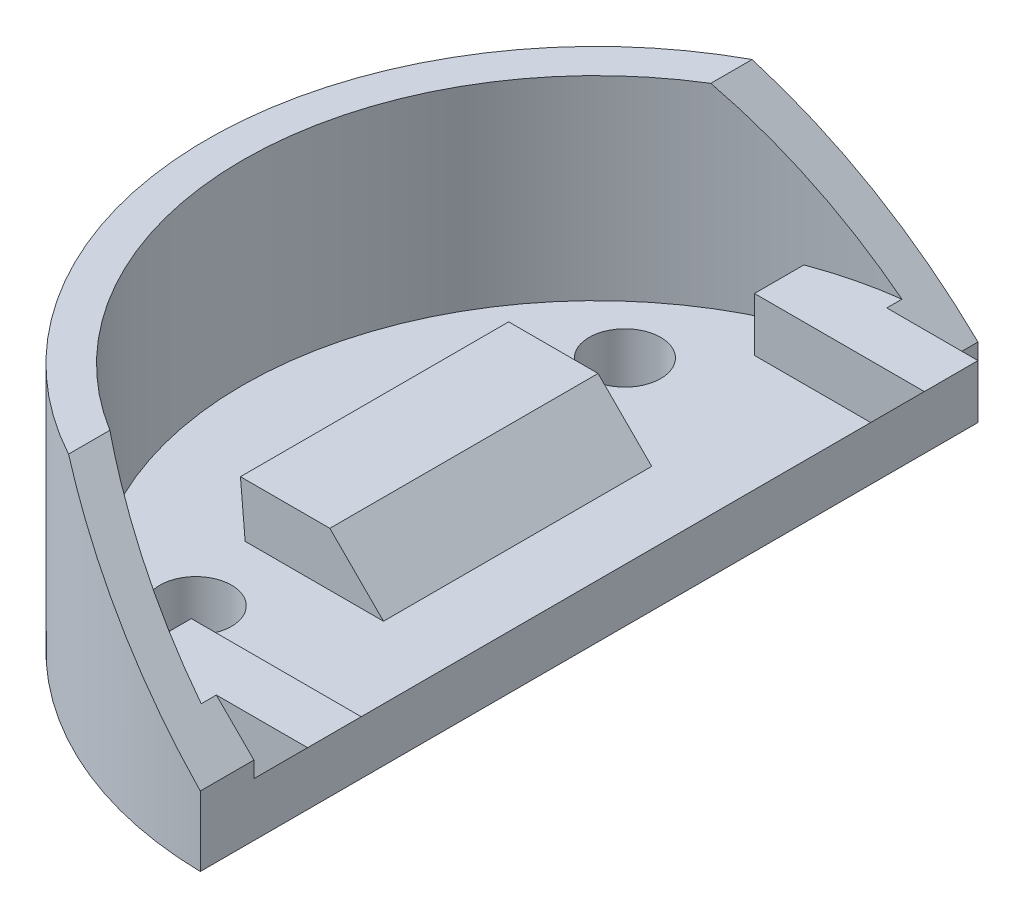
ISO-10303-21;
HEADER;
FILE_DESCRIPTION(('STEP AP214'),'2;1');
FILE_NAME('part.step','',(''),(''),'','','');
FILE_SCHEMA(('AUTOMOTIVE_DESIGN { 1 0 10303 214 1 1 1 1 }'));
ENDSEC;
DATA;
#1=APPLICATION_CONTEXT('core data for automotive mechanical design processes');
#2=APPLICATION_PROTOCOL_DEFINITION('international standard','automotive_design',2000,#1);
#3=PRODUCT_CONTEXT('',#1,'mechanical');
#4=PRODUCT('Part','Part','',(#3));
#5=PRODUCT_RELATED_PRODUCT_CATEGORY('part','',(#4));
#6=PRODUCT_DEFINITION_FORMATION('','',#4);
#7=PRODUCT_DEFINITION_CONTEXT('part definition',#1,'design');
#8=PRODUCT_DEFINITION('design','',#6,#7);
#9=PRODUCT_DEFINITION_SHAPE('','',#8);
#10=(LENGTH_UNIT() NAMED_UNIT(*) SI_UNIT(.MILLI.,.METRE.));
#11=(NAMED_UNIT(*) PLANE_ANGLE_UNIT() SI_UNIT($,.RADIAN.));
#12=(NAMED_UNIT(*) SI_UNIT($,.STERADIAN.) SOLID_ANGLE_UNIT());
#13=UNCERTAINTY_MEASURE_WITH_UNIT(LENGTH_MEASURE(1.E-05),#10,'distance_accuracy_value','');
#14=(GEOMETRIC_REPRESENTATION_CONTEXT(3) GLOBAL_UNCERTAINTY_ASSIGNED_CONTEXT((#13)) GLOBAL_UNIT_ASSIGNED_CONTEXT((#10,
#11,#12)) REPRESENTATION_CONTEXT('',''));
#15=CARTESIAN_POINT('',(0.,0.,0.));
#16=DIRECTION('',(0.,0.,1.));
#17=DIRECTION('',(1.,0.,0.));
#18=AXIS2_PLACEMENT_3D('',#15,#16,#17);
#19=CARTESIAN_POINT('',(0.,3.81,0.));
#20=DIRECTION('',(0.,1.,0.));
#21=DIRECTION('',(0.,0.,1.));
#22=AXIS2_PLACEMENT_3D('',#19,#20,#21);
#23=PLANE('',#22);
#24=CARTESIAN_POINT('',(-13.1820790968143,3.81,15.2400000000031));
#25=DIRECTION('',(0.,1.,0.));
#26=DIRECTION('',(0.,0.,1.));
#27=AXIS2_PLACEMENT_3D('',#24,#25,#26);
#28=CIRCLE('',#27,2.54000000000118);
#29=CARTESIAN_POINT('',(-13.1820790968143,3.81,12.700000000002));
#30=VERTEX_POINT('',#29);
#31=EDGE_CURVE('E223',#30,#30,#28,.T.);
#32=ORIENTED_EDGE('',*,*,#31,.F.);
#33=EDGE_LOOP('',(#32));
#34=FACE_BOUND('',#33,.T.);
#35=CARTESIAN_POINT('',(-13.1820790968145,3.81,-15.2399999999969));
#36=DIRECTION('',(0.,1.,0.));
#37=DIRECTION('',(0.,0.,1.));
#38=AXIS2_PLACEMENT_3D('',#35,#36,#37);
#39=CIRCLE('',#38,2.54000000000163);
#40=CARTESIAN_POINT('',(-13.1820790968145,3.81,-17.7799999999985));
#41=VERTEX_POINT('',#40);
#42=EDGE_CURVE('E226',#41,#41,#39,.T.);
#43=ORIENTED_EDGE('',*,*,#42,.F.);
#44=EDGE_LOOP('',(#43));
#45=FACE_BOUND('',#44,.T.);
#46=DIRECTION('',(0.,0.,1.));
#47=VECTOR('',#46,1.);
#48=CARTESIAN_POINT('',(-5.5620790968136,3.81,-9.525));
#49=LINE('',#48,#47);
#50=CARTESIAN_POINT('',(-5.5620790968136,3.81,-9.525));
#51=VERTEX_POINT('',#50);
#52=CARTESIAN_POINT('',(-5.56207909681359,3.81,9.525));
#53=VERTEX_POINT('',#52);
#54=EDGE_CURVE('E202',#51,#53,#49,.T.);
#55=ORIENTED_EDGE('',*,*,#54,.T.);
#56=DIRECTION('',(-1.,0.,0.));
#57=VECTOR('',#56,1.);
#58=CARTESIAN_POINT('',(-5.56207909681359,3.81,9.525));
#59=LINE('',#58,#57);
#60=CARTESIAN_POINT('',(-15.3887472887798,3.81,9.52500000000001));
#61=VERTEX_POINT('',#60);
#62=EDGE_CURVE('E197',#53,#61,#59,.T.);
#63=ORIENTED_EDGE('',*,*,#62,.T.);
#64=DIRECTION('',(0.,0.,-1.));
#65=VECTOR('',#64,1.);
#66=CARTESIAN_POINT('',(-15.3887472887798,3.81,14.9131536726415));
#67=LINE('',#66,#65);
#68=CARTESIAN_POINT('',(-15.3887472887798,3.81,-9.525));
#69=VERTEX_POINT('',#68);
#70=EDGE_CURVE('E391',#61,#69,#67,.T.);
#71=ORIENTED_EDGE('',*,*,#70,.T.);
#72=DIRECTION('',(-1.,0.,0.));
#73=VECTOR('',#72,1.);
#74=CARTESIAN_POINT('',(-5.5620790968136,3.81,-9.525));
#75=LINE('',#74,#73);
#76=EDGE_CURVE('E206',#51,#69,#75,.T.);
#77=ORIENTED_EDGE('',*,*,#76,.F.);
#78=EDGE_LOOP('',(#55,#63,#71,#77));
#79=FACE_BOUND('',#78,.T.);
#80=DIRECTION('',(0.,0.,1.));
#81=VECTOR('',#80,1.);
#82=CARTESIAN_POINT('',(-8.7370790968136,3.81,-23.8082929594574));
#83=LINE('',#82,#81);
#84=CARTESIAN_POINT('',(-8.7370790968136,3.81,-23.5120528000423));
#85=VERTEX_POINT('',#84);
#86=CARTESIAN_POINT('',(-8.7370790968136,3.81,-19.9982929594574));
#87=VERTEX_POINT('',#86);
#88=EDGE_CURVE('E215',#85,#87,#83,.T.);
#89=ORIENTED_EDGE('',*,*,#88,.F.);
#90=CARTESIAN_POINT('',(0.,3.81,0.));
#91=DIRECTION('',(0.,-1.,0.));
#92=DIRECTION('',(0.,0.,1.));
#93=AXIS2_PLACEMENT_3D('',#90,#91,#92);
#94=CIRCLE('',#93,25.082926025804);
#95=CARTESIAN_POINT('',(-8.73707909681359,3.81,23.5120528000424));
#96=VERTEX_POINT('',#95);
#97=EDGE_CURVE('E188',#96,#85,#94,.T.);
#98=ORIENTED_EDGE('',*,*,#97,.F.);
#99=DIRECTION('',(0.,0.,-1.));
#100=VECTOR('',#99,1.);
#101=CARTESIAN_POINT('',(-8.73707909681359,3.81,23.8082929594574));
#102=LINE('',#101,#100);
#103=CARTESIAN_POINT('',(-8.73707909681359,3.81,19.9982929594574));
#104=VERTEX_POINT('',#103);
#105=EDGE_CURVE('E320',#96,#104,#102,.T.);
#106=ORIENTED_EDGE('',*,*,#105,.T.);
#107=DIRECTION('',(-1.,0.,0.));
#108=VECTOR('',#107,1.);
#109=CARTESIAN_POINT('',(4.59792090318641,3.81,19.9982929594574));
#110=LINE('',#109,#108);
#111=CARTESIAN_POINT('',(-0.482079096814084,3.81,19.9982929594574));
#112=VERTEX_POINT('',#111);
#113=EDGE_CURVE('E317',#112,#104,#110,.T.);
#114=ORIENTED_EDGE('',*,*,#113,.F.);
#115=DIRECTION('',(0.,0.,1.));
#116=VECTOR('',#115,1.);
#117=CARTESIAN_POINT('',(-0.482079096813858,3.81,0.));
#118=LINE('',#117,#116);
#119=CARTESIAN_POINT('',(-0.482079096813633,3.81,-19.9982929594574));
#120=VERTEX_POINT('',#119);
#121=EDGE_CURVE('E218',#120,#112,#118,.T.);
#122=ORIENTED_EDGE('',*,*,#121,.F.);
#123=DIRECTION('',(-1.,0.,0.));
#124=VECTOR('',#123,1.);
#125=CARTESIAN_POINT('',(4.5979209031864,3.81,-19.9982929594574));
#126=LINE('',#125,#124);
#127=EDGE_CURVE('E333',#120,#87,#126,.T.);
#128=ORIENTED_EDGE('',*,*,#127,.T.);
#129=EDGE_LOOP('',(#89,#98,#106,#114,#122,#128));
#130=FACE_BOUND('',#129,.T.);
#131=ADVANCED_FACE('F47',(#34,#45,#79,#130),#23,.T.);
#132=CARTESIAN_POINT('',(-8.7370790968136,7.62,-23.8082929594574));
#133=DIRECTION('',(1.,0.,0.));
#134=DIRECTION('',(0.,0.,-1.));
#135=AXIS2_PLACEMENT_3D('',#132,#133,#134);
#136=PLANE('',#135);
#137=DIRECTION('',(0.,-1.,0.));
#138=VECTOR('',#137,1.);
#139=CARTESIAN_POINT('',(-8.73707909681359,17.653,-23.5120528000423));
#140=LINE('',#139,#138);
#141=CARTESIAN_POINT('',(-8.7370790968136,7.62,-23.5120528000423));
#142=VERTEX_POINT('',#141);
#143=EDGE_CURVE('E303',#85,#142,#140,.F.);
#144=ORIENTED_EDGE('',*,*,#143,.F.);
#145=ORIENTED_EDGE('',*,*,#88,.T.);
#146=DIRECTION('',(0.,-1.,0.));
#147=VECTOR('',#146,1.);
#148=CARTESIAN_POINT('',(-8.7370790968136,7.62,-19.9982929594574));
#149=LINE('',#148,#147);
#150=CARTESIAN_POINT('',(-8.7370790968136,7.62,-19.9982929594574));
#151=VERTEX_POINT('',#150);
#152=EDGE_CURVE('E329',#151,#87,#149,.T.);
#153=ORIENTED_EDGE('',*,*,#152,.F.);
#154=DIRECTION('',(0.,0.,1.));
#155=VECTOR('',#154,1.);
#156=CARTESIAN_POINT('',(-8.7370790968136,7.62,-26.2043117655477));
#157=LINE('',#156,#155);
#158=EDGE_CURVE('E337',#142,#151,#157,.T.);
#159=ORIENTED_EDGE('',*,*,#158,.F.);
#160=EDGE_LOOP('',(#144,#145,#153,#159));
#161=FACE_BOUND('',#160,.T.);
#162=ADVANCED_FACE('F342',(#161),#136,.F.);
#163=CARTESIAN_POINT('',(0.,7.62,0.));
#164=DIRECTION('',(0.,-1.,0.));
#165=DIRECTION('',(0.,0.,-1.));
#166=AXIS2_PLACEMENT_3D('',#163,#164,#165);
#167=PLANE('',#166);
#168=DIRECTION('',(-1.,0.,0.));
#169=VECTOR('',#168,1.);
#170=CARTESIAN_POINT('',(4.5979209031864,7.62,-23.8082929594574));
#171=LINE('',#170,#169);
#172=CARTESIAN_POINT('',(3.32792090318635,7.62,-23.8082929594574));
#173=VERTEX_POINT('',#172);
#174=CARTESIAN_POINT('',(-3.14907909681375,7.62,-23.8082929594574));
#175=VERTEX_POINT('',#174);
#176=EDGE_CURVE('E209',#173,#175,#171,.T.);
#177=ORIENTED_EDGE('',*,*,#176,.T.);
#178=DIRECTION('',(0.,0.,1.));
#179=VECTOR('',#178,1.);
#180=CARTESIAN_POINT('',(-3.14907909681397,7.62,0.));
#181=LINE('',#180,#179);
#182=CARTESIAN_POINT('',(-3.14907909681374,7.62,-24.8844625993403));
#183=VERTEX_POINT('',#182);
#184=EDGE_CURVE('E273',#175,#183,#181,.F.);
#185=ORIENTED_EDGE('',*,*,#184,.T.);
#186=CARTESIAN_POINT('',(0.,7.62,0.));
#187=DIRECTION('',(0.,-1.,0.));
#188=DIRECTION('',(0.,0.,-1.));
#189=AXIS2_PLACEMENT_3D('',#186,#187,#188);
#190=CIRCLE('',#189,25.082926025804);
#191=EDGE_CURVE('E297',#142,#183,#190,.T.);
#192=ORIENTED_EDGE('',*,*,#191,.F.);
#193=ORIENTED_EDGE('',*,*,#158,.T.);
#194=DIRECTION('',(-1.,0.,0.));
#195=VECTOR('',#194,1.);
#196=CARTESIAN_POINT('',(4.5979209031864,7.62,-19.9982929594574));
#197=LINE('',#196,#195);
#198=CARTESIAN_POINT('',(3.32792090318635,7.62,-19.9982929594574));
#199=VERTEX_POINT('',#198);
#200=EDGE_CURVE('E332',#199,#151,#197,.T.);
#201=ORIENTED_EDGE('',*,*,#200,.F.);
#202=DIRECTION('',(0.,0.,1.));
#203=VECTOR('',#202,1.);
#204=CARTESIAN_POINT('',(3.32792090318635,7.62,0.));
#205=LINE('',#204,#203);
#206=EDGE_CURVE('E254',#199,#173,#205,.F.);
#207=ORIENTED_EDGE('',*,*,#206,.T.);
#208=EDGE_LOOP('',(#177,#185,#192,#193,#201,#207));
#209=FACE_BOUND('',#208,.T.);
#210=ADVANCED_FACE('F295',(#209),#167,.F.);
#211=CARTESIAN_POINT('',(-8.73707909681359,7.62,23.8082929594574));
#212=DIRECTION('',(-1.,0.,0.));
#213=DIRECTION('',(0.,0.,1.));
#214=AXIS2_PLACEMENT_3D('',#211,#212,#213);
#215=PLANE('',#214);
#216=ORIENTED_EDGE('',*,*,#105,.F.);
#217=DIRECTION('',(0.,-1.,0.));
#218=VECTOR('',#217,1.);
#219=CARTESIAN_POINT('',(-8.73707909681359,17.653,23.5120528000423));
#220=LINE('',#219,#218);
#221=CARTESIAN_POINT('',(-8.73707909681359,7.62,23.5120528000424));
#222=VERTEX_POINT('',#221);
#223=EDGE_CURVE('E304',#96,#222,#220,.F.);
#224=ORIENTED_EDGE('',*,*,#223,.T.);
#225=DIRECTION('',(0.,0.,-1.));
#226=VECTOR('',#225,1.);
#227=CARTESIAN_POINT('',(-8.73707909681359,7.62,26.2043117655477));
#228=LINE('',#227,#226);
#229=CARTESIAN_POINT('',(-8.73707909681359,7.62,19.9982929594574));
#230=VERTEX_POINT('',#229);
#231=EDGE_CURVE('E321',#222,#230,#228,.T.);
#232=ORIENTED_EDGE('',*,*,#231,.T.);
#233=DIRECTION('',(0.,-1.,0.));
#234=VECTOR('',#233,1.);
#235=CARTESIAN_POINT('',(-8.73707909681359,7.62,19.9982929594574));
#236=LINE('',#235,#234);
#237=EDGE_CURVE('E313',#230,#104,#236,.T.);
#238=ORIENTED_EDGE('',*,*,#237,.T.);
#239=EDGE_LOOP('',(#216,#224,#232,#238));
#240=FACE_BOUND('',#239,.T.);
#241=ADVANCED_FACE('F462',(#240),#215,.T.);
#242=CARTESIAN_POINT('',(0.,7.62,0.));
#243=DIRECTION('',(0.,-1.,0.));
#244=DIRECTION('',(0.,0.,-1.));
#245=AXIS2_PLACEMENT_3D('',#242,#243,#244);
#246=PLANE('',#245);
#247=DIRECTION('',(0.,0.,1.));
#248=VECTOR('',#247,1.);
#249=CARTESIAN_POINT('',(-3.14907909681397,7.62,0.));
#250=LINE('',#249,#248);
#251=CARTESIAN_POINT('',(-3.14907909681421,7.62,24.8844625993403));
#252=VERTEX_POINT('',#251);
#253=CARTESIAN_POINT('',(-3.1490790968142,7.62,23.8082929594574));
#254=VERTEX_POINT('',#253);
#255=EDGE_CURVE('E278',#252,#254,#250,.F.);
#256=ORIENTED_EDGE('',*,*,#255,.T.);
#257=DIRECTION('',(-1.,0.,0.));
#258=VECTOR('',#257,1.);
#259=CARTESIAN_POINT('',(4.59792090318641,7.62,23.8082929594574));
#260=LINE('',#259,#258);
#261=CARTESIAN_POINT('',(3.32792090318633,7.62,23.8082929594574));
#262=VERTEX_POINT('',#261);
#263=EDGE_CURVE('E62',#262,#254,#260,.T.);
#264=ORIENTED_EDGE('',*,*,#263,.F.);
#265=DIRECTION('',(0.,0.,-1.));
#266=VECTOR('',#265,1.);
#267=CARTESIAN_POINT('',(3.32792090318633,7.62,23.8082929594574));
#268=LINE('',#267,#266);
#269=CARTESIAN_POINT('',(3.32792090318633,7.62,19.9982929594574));
#270=VERTEX_POINT('',#269);
#271=EDGE_CURVE('E246',#262,#270,#268,.T.);
#272=ORIENTED_EDGE('',*,*,#271,.T.);
#273=DIRECTION('',(-1.,0.,0.));
#274=VECTOR('',#273,1.);
#275=CARTESIAN_POINT('',(4.59792090318641,7.62,19.9982929594574));
#276=LINE('',#275,#274);
#277=EDGE_CURVE('E324',#270,#230,#276,.T.);
#278=ORIENTED_EDGE('',*,*,#277,.T.);
#279=ORIENTED_EDGE('',*,*,#231,.F.);
#280=CARTESIAN_POINT('',(0.,7.62,0.));
#281=DIRECTION('',(0.,-1.,0.));
#282=DIRECTION('',(0.,0.,-1.));
#283=AXIS2_PLACEMENT_3D('',#280,#281,#282);
#284=CIRCLE('',#283,25.082926025804);
#285=EDGE_CURVE('E244',#252,#222,#284,.T.);
#286=ORIENTED_EDGE('',*,*,#285,.F.);
#287=EDGE_LOOP('',(#256,#264,#272,#278,#279,#286));
#288=FACE_BOUND('',#287,.T.);
#289=ADVANCED_FACE('F367',(#288),#246,.F.);
#290=CARTESIAN_POINT('',(0.,3.81,0.));
#291=DIRECTION('',(0.,-1.,0.));
#292=DIRECTION('',(0.,0.,-1.));
#293=AXIS2_PLACEMENT_3D('',#290,#291,#292);
#294=CYLINDRICAL_SURFACE('',#293,27.6225);
#295=CARTESIAN_POINT('',(0.,17.653,0.));
#296=DIRECTION('',(0.,1.,0.));
#297=DIRECTION('',(0.,0.,1.));
#298=AXIS2_PLACEMENT_3D('',#295,#296,#297);
#299=CIRCLE('',#298,27.6225);
#300=CARTESIAN_POINT('',(-13.1820790968138,17.653,-24.2741693356404));
#301=VERTEX_POINT('',#300);
#302=CARTESIAN_POINT('',(-13.1820790968143,17.653,24.2741693356401));
#303=VERTEX_POINT('',#302);
#304=EDGE_CURVE('E387',#301,#303,#299,.T.);
#305=ORIENTED_EDGE('',*,*,#304,.F.);
#306=CARTESIAN_POINT('',(0.,4.47092090318606,0.));
#307=DIRECTION('',(-0.707106781186544,-0.707106781186551,0.));
#308=DIRECTION('',(0.707106781186551,-0.707106781186544,0.));
#309=AXIS2_PLACEMENT_3D('',#306,#307,#308);
#310=ELLIPSE('',#309,39.0641141266506,27.6225);
#311=CARTESIAN_POINT('',(-0.482079096813597,4.95299999999991,-27.6182929594574));
#312=VERTEX_POINT('',#311);
#313=EDGE_CURVE('E267',#301,#312,#310,.T.);
#314=ORIENTED_EDGE('',*,*,#313,.T.);
#315=DIRECTION('',(0.,-1.,0.));
#316=VECTOR('',#315,1.);
#317=CARTESIAN_POINT('',(-0.482079096813597,3.81,-27.6182929594574));
#318=LINE('',#317,#316);
#319=CARTESIAN_POINT('',(-0.482079096813597,0.,-27.6182929594574));
#320=VERTEX_POINT('',#319);
#321=EDGE_CURVE('E229',#312,#320,#318,.T.);
#322=ORIENTED_EDGE('',*,*,#321,.T.);
#323=CARTESIAN_POINT('',(0.,0.,0.));
#324=DIRECTION('',(0.,1.,0.));
#325=DIRECTION('',(0.,0.,1.));
#326=AXIS2_PLACEMENT_3D('',#323,#324,#325);
#327=CIRCLE('',#326,27.6225);
#328=CARTESIAN_POINT('',(-0.48207909681412,0.,27.6182929594574));
#329=VERTEX_POINT('',#328);
#330=EDGE_CURVE('E213',#320,#329,#327,.T.);
#331=ORIENTED_EDGE('',*,*,#330,.T.);
#332=DIRECTION('',(0.,-1.,0.));
#333=VECTOR('',#332,1.);
#334=CARTESIAN_POINT('',(-0.48207909681412,3.81,27.6182929594574));
#335=LINE('',#334,#333);
#336=CARTESIAN_POINT('',(-0.48207909681412,4.95299999999991,27.6182929594574));
#337=VERTEX_POINT('',#336);
#338=EDGE_CURVE('E242',#337,#329,#335,.T.);
#339=ORIENTED_EDGE('',*,*,#338,.F.);
#340=CARTESIAN_POINT('',(0.,4.47092090318606,0.));
#341=DIRECTION('',(-0.707106781186544,-0.707106781186551,0.));
#342=DIRECTION('',(0.707106781186551,-0.707106781186544,0.));
#343=AXIS2_PLACEMENT_3D('',#340,#341,#342);
#344=ELLIPSE('',#343,39.0641141266506,27.6225);
#345=EDGE_CURVE('E265',#337,#303,#344,.T.);
#346=ORIENTED_EDGE('',*,*,#345,.T.);
#347=EDGE_LOOP('',(#305,#314,#322,#331,#339,#346));
#348=FACE_BOUND('',#347,.T.);
#349=ADVANCED_FACE('F379',(#348),#294,.T.);
#350=CARTESIAN_POINT('',(-13.1820790968143,3.81,15.2400000000031));
#351=DIRECTION('',(0.,-1.,0.));
#352=DIRECTION('',(0.,0.,-1.));
#353=AXIS2_PLACEMENT_3D('',#350,#351,#352);
#354=CYLINDRICAL_SURFACE('',#353,2.54000000000118);
#355=CARTESIAN_POINT('',(-13.1820790968143,0.,15.2400000000031));
#356=DIRECTION('',(0.,1.,0.));
#357=DIRECTION('',(0.,0.,1.));
#358=AXIS2_PLACEMENT_3D('',#355,#356,#357);
#359=CIRCLE('',#358,2.54000000000118);
#360=CARTESIAN_POINT('',(-13.1820790968143,0.,12.700000000002));
#361=VERTEX_POINT('',#360);
#362=EDGE_CURVE('E235',#361,#361,#359,.T.);
#363=CARTESIAN_POINT('',(-13.1820790968143,3.81,12.700000000002));
#364=CARTESIAN_POINT('',(-13.1820790968143,3.7703125,12.700000000002));
#365=CARTESIAN_POINT('',(-13.1820790968143,3.730625,12.700000000002));
#366=CARTESIAN_POINT('',(-13.1820790968143,3.65125,12.700000000002));
#367=CARTESIAN_POINT('',(-13.1820790968143,3.6115625,12.700000000002));
#368=CARTESIAN_POINT('',(-13.1820790968143,3.5321875,12.700000000002));
#369=CARTESIAN_POINT('',(-13.1820790968143,3.4925,12.700000000002));
#370=CARTESIAN_POINT('',(-13.1820790968143,3.413125,12.700000000002));
#371=CARTESIAN_POINT('',(-13.1820790968143,3.3734375,12.700000000002));
#372=CARTESIAN_POINT('',(-13.1820790968143,3.2940625,12.700000000002));
#373=CARTESIAN_POINT('',(-13.1820790968143,3.254375,12.700000000002));
#374=CARTESIAN_POINT('',(-13.1820790968143,3.175,12.700000000002));
#375=CARTESIAN_POINT('',(-13.1820790968143,3.1353125,12.700000000002));
#376=CARTESIAN_POINT('',(-13.1820790968143,3.0559375,12.700000000002));
#377=CARTESIAN_POINT('',(-13.1820790968143,3.01625,12.700000000002));
#378=CARTESIAN_POINT('',(-13.1820790968143,2.936875,12.700000000002));
#379=CARTESIAN_POINT('',(-13.1820790968143,2.8971875,12.700000000002));
#380=CARTESIAN_POINT('',(-13.1820790968143,2.8178125,12.700000000002));
#381=CARTESIAN_POINT('',(-13.1820790968143,2.778125,12.700000000002));
#382=CARTESIAN_POINT('',(-13.1820790968143,2.69875,12.700000000002));
#383=CARTESIAN_POINT('',(-13.1820790968143,2.6590625,12.700000000002));
#384=CARTESIAN_POINT('',(-13.1820790968143,2.5796875,12.700000000002));
#385=CARTESIAN_POINT('',(-13.1820790968143,2.54,12.700000000002));
#386=CARTESIAN_POINT('',(-13.1820790968143,2.460625,12.700000000002));
#387=CARTESIAN_POINT('',(-13.1820790968143,2.4209375,12.700000000002));
#388=CARTESIAN_POINT('',(-13.1820790968143,2.3415625,12.700000000002));
#389=CARTESIAN_POINT('',(-13.1820790968143,2.301875,12.700000000002));
#390=CARTESIAN_POINT('',(-13.1820790968143,2.2225,12.700000000002));
#391=CARTESIAN_POINT('',(-13.1820790968143,2.1828125,12.700000000002));
#392=CARTESIAN_POINT('',(-13.1820790968143,2.1034375,12.700000000002));
#393=CARTESIAN_POINT('',(-13.1820790968143,2.06375,12.700000000002));
#394=CARTESIAN_POINT('',(-13.1820790968143,1.984375,12.700000000002));
#395=CARTESIAN_POINT('',(-13.1820790968143,1.9446875,12.700000000002));
#396=CARTESIAN_POINT('',(-13.1820790968143,1.8653125,12.700000000002));
#397=CARTESIAN_POINT('',(-13.1820790968143,1.825625,12.700000000002));
#398=CARTESIAN_POINT('',(-13.1820790968143,1.74625,12.700000000002));
#399=CARTESIAN_POINT('',(-13.1820790968143,1.7065625,12.700000000002));
#400=CARTESIAN_POINT('',(-13.1820790968143,1.6271875,12.700000000002));
#401=CARTESIAN_POINT('',(-13.1820790968143,1.5875,12.700000000002));
#402=CARTESIAN_POINT('',(-13.1820790968143,1.508125,12.700000000002));
#403=CARTESIAN_POINT('',(-13.1820790968143,1.4684375,12.700000000002));
#404=CARTESIAN_POINT('',(-13.1820790968143,1.3890625,12.700000000002));
#405=CARTESIAN_POINT('',(-13.1820790968143,1.349375,12.700000000002));
#406=CARTESIAN_POINT('',(-13.1820790968143,1.27,12.700000000002));
#407=CARTESIAN_POINT('',(-13.1820790968143,1.2303125,12.700000000002));
#408=CARTESIAN_POINT('',(-13.1820790968143,1.1509375,12.700000000002));
#409=CARTESIAN_POINT('',(-13.1820790968143,1.11125,12.700000000002));
#410=CARTESIAN_POINT('',(-13.1820790968143,1.031875,12.700000000002));
#411=CARTESIAN_POINT('',(-13.1820790968143,0.9921875,12.700000000002));
#412=CARTESIAN_POINT('',(-13.1820790968143,0.9128125,12.700000000002));
#413=CARTESIAN_POINT('',(-13.1820790968143,0.873125,12.700000000002));
#414=CARTESIAN_POINT('',(-13.1820790968143,0.79375,12.700000000002));
#415=CARTESIAN_POINT('',(-13.1820790968143,0.7540625,12.700000000002));
#416=CARTESIAN_POINT('',(-13.1820790968143,0.6746875,12.700000000002));
#417=CARTESIAN_POINT('',(-13.1820790968143,0.635,12.700000000002));
#418=CARTESIAN_POINT('',(-13.1820790968143,0.555625,12.700000000002));
#419=CARTESIAN_POINT('',(-13.1820790968143,0.5159375,12.700000000002));
#420=CARTESIAN_POINT('',(-13.1820790968143,0.4365625,12.700000000002));
#421=CARTESIAN_POINT('',(-13.1820790968143,0.396875,12.700000000002));
#422=CARTESIAN_POINT('',(-13.1820790968143,0.3175,12.700000000002));
#423=CARTESIAN_POINT('',(-13.1820790968143,0.2778125,12.700000000002));
#424=CARTESIAN_POINT('',(-13.1820790968143,0.1984375,12.700000000002));
#425=CARTESIAN_POINT('',(-13.1820790968143,0.15875,12.700000000002));
#426=CARTESIAN_POINT('',(-13.1820790968143,0.0793749999999999,12.700000000002));
#427=CARTESIAN_POINT('',(-13.1820790968143,0.0396874999999999,12.700000000002));
#428=CARTESIAN_POINT('',(-13.1820790968143,0.,12.700000000002));
#429=B_SPLINE_CURVE_WITH_KNOTS('',3,(#363,#364,#365,#366,#367,#368,#369,#370,#371,#372,#373,
#374,#375,#376,#377,#378,#379,#380,#381,#382,#383,#384,#385,#386,#387,#388,#389,#390,#391,#392,
#393,#394,#395,#396,#397,#398,#399,#400,#401,#402,#403,#404,#405,#406,#407,#408,#409,#410,#411,
#412,#413,#414,#415,#416,#417,#418,#419,#420,#421,#422,#423,#424,#425,#426,#427,#428),
.UNSPECIFIED.,.F.,.F.,(4,2,2,2,2,2,2,2,2,2,2,2,2,2,2,2,2,2,2,2,2,2,2,2,2,2,2,2,2,2,2,2,4),(0.,
0.1190625,0.238125,0.3571875,0.47625,0.5953125,0.714375,0.8334375,0.9525,1.0715625,1.190625,
1.3096875,1.42875,1.5478125,1.666875,1.7859375,1.905,2.0240625,2.143125,2.2621875,2.38125,
2.5003125,2.619375,2.7384375,2.8575,2.9765625,3.095625,3.2146875,3.33375,3.4528125,3.571875,
3.6909375,3.81),.UNSPECIFIED.);
#430=EDGE_CURVE('BSEAM425',#30,#361,#429,.T.);
#431=ORIENTED_EDGE('',*,*,#31,.T.);
#432=ORIENTED_EDGE('',*,*,#362,.F.);
#433=ORIENTED_EDGE('',*,*,#430,.T.);
#434=ORIENTED_EDGE('',*,*,#430,.F.);
#435=EDGE_LOOP('',(#431,#433,#432,#434));
#436=FACE_BOUND('',#435,.T.);
#437=ADVANCED_FACE('F425',(#436),#354,.F.);
#438=CARTESIAN_POINT('',(-0.482079096813858,3.81,0.));
#439=DIRECTION('',(1.,0.,0.));
#440=DIRECTION('',(0.,0.,-1.));
#441=AXIS2_PLACEMENT_3D('',#438,#439,#440);
#442=PLANE('',#441);
#443=ORIENTED_EDGE('',*,*,#321,.F.);
#444=DIRECTION('',(0.,0.,1.));
#445=VECTOR('',#444,1.);
#446=CARTESIAN_POINT('',(-0.482079096813858,4.95299999999991,0.));
#447=LINE('',#446,#445);
#448=CARTESIAN_POINT('',(-0.482079096813633,4.95299999999992,-23.8082929594574));
#449=VERTEX_POINT('',#448);
#450=EDGE_CURVE('E271',#312,#449,#447,.T.);
#451=ORIENTED_EDGE('',*,*,#450,.T.);
#452=DIRECTION('',(0.,-1.,0.));
#453=VECTOR('',#452,1.);
#454=CARTESIAN_POINT('',(-0.482079096813633,7.62,-23.8082929594574));
#455=LINE('',#454,#453);
#456=CARTESIAN_POINT('',(-0.482079096813633,3.81,-23.8082929594574));
#457=VERTEX_POINT('',#456);
#458=EDGE_CURVE('E287',#449,#457,#455,.T.);
#459=ORIENTED_EDGE('',*,*,#458,.T.);
#460=EDGE_CURVE('E221',#457,#120,#118,.T.);
#461=ORIENTED_EDGE('',*,*,#460,.T.);
#462=ORIENTED_EDGE('',*,*,#121,.T.);
#463=CARTESIAN_POINT('',(-0.482079096814084,3.81,23.8082929594574));
#464=VERTEX_POINT('',#463);
#465=EDGE_CURVE('E222',#112,#464,#118,.T.);
#466=ORIENTED_EDGE('',*,*,#465,.T.);
#467=DIRECTION('',(0.,-1.,0.));
#468=VECTOR('',#467,1.);
#469=CARTESIAN_POINT('',(-0.482079096813627,7.62,23.8082929594574));
#470=LINE('',#469,#468);
#471=CARTESIAN_POINT('',(-0.482079096813627,4.95299999999991,23.8082929594574));
#472=VERTEX_POINT('',#471);
#473=EDGE_CURVE('E306',#472,#464,#470,.T.);
#474=ORIENTED_EDGE('',*,*,#473,.F.);
#475=DIRECTION('',(0.,0.,1.));
#476=VECTOR('',#475,1.);
#477=CARTESIAN_POINT('',(-0.482079096813858,4.95299999999991,0.));
#478=LINE('',#477,#476);
#479=EDGE_CURVE('E269',#472,#337,#478,.T.);
#480=ORIENTED_EDGE('',*,*,#479,.T.);
#481=ORIENTED_EDGE('',*,*,#338,.T.);
#482=DIRECTION('',(0.,0.,1.));
#483=VECTOR('',#482,1.);
#484=CARTESIAN_POINT('',(-0.482079096813858,0.,0.));
#485=LINE('',#484,#483);
#486=EDGE_CURVE('E232',#320,#329,#485,.T.);
#487=ORIENTED_EDGE('',*,*,#486,.F.);
#488=EDGE_LOOP('',(#443,#451,#459,#461,#462,#466,#474,#480,#481,#487));
#489=FACE_BOUND('',#488,.T.);
#490=ADVANCED_FACE('F356',(#489),#442,.T.);
#491=CARTESIAN_POINT('',(-13.1820790968145,3.81,-15.2399999999969));
#492=DIRECTION('',(0.,-1.,0.));
#493=DIRECTION('',(0.,0.,-1.));
#494=AXIS2_PLACEMENT_3D('',#491,#492,#493);
#495=CYLINDRICAL_SURFACE('',#494,2.54000000000163);
#496=CARTESIAN_POINT('',(-13.1820790968145,0.,-15.2399999999969));
#497=DIRECTION('',(0.,1.,0.));
#498=DIRECTION('',(0.,0.,1.));
#499=AXIS2_PLACEMENT_3D('',#496,#497,#498);
#500=CIRCLE('',#499,2.54000000000163);
#501=CARTESIAN_POINT('',(-13.1820790968145,0.,-17.7799999999985));
#502=VERTEX_POINT('',#501);
#503=EDGE_CURVE('E238',#502,#502,#500,.T.);
#504=CARTESIAN_POINT('',(-13.1820790968145,3.81,-17.7799999999985));
#505=CARTESIAN_POINT('',(-13.1820790968145,3.7703125,-17.7799999999985));
#506=CARTESIAN_POINT('',(-13.1820790968145,3.730625,-17.7799999999985));
#507=CARTESIAN_POINT('',(-13.1820790968145,3.65125,-17.7799999999985));
#508=CARTESIAN_POINT('',(-13.1820790968145,3.6115625,-17.7799999999985));
#509=CARTESIAN_POINT('',(-13.1820790968145,3.5321875,-17.7799999999985));
#510=CARTESIAN_POINT('',(-13.1820790968145,3.4925,-17.7799999999985));
#511=CARTESIAN_POINT('',(-13.1820790968145,3.413125,-17.7799999999985));
#512=CARTESIAN_POINT('',(-13.1820790968145,3.3734375,-17.7799999999985));
#513=CARTESIAN_POINT('',(-13.1820790968145,3.2940625,-17.7799999999985));
#514=CARTESIAN_POINT('',(-13.1820790968145,3.254375,-17.7799999999985));
#515=CARTESIAN_POINT('',(-13.1820790968145,3.175,-17.7799999999985));
#516=CARTESIAN_POINT('',(-13.1820790968145,3.1353125,-17.7799999999985));
#517=CARTESIAN_POINT('',(-13.1820790968145,3.0559375,-17.7799999999985));
#518=CARTESIAN_POINT('',(-13.1820790968145,3.01625,-17.7799999999985));
#519=CARTESIAN_POINT('',(-13.1820790968145,2.936875,-17.7799999999985));
#520=CARTESIAN_POINT('',(-13.1820790968145,2.8971875,-17.7799999999985));
#521=CARTESIAN_POINT('',(-13.1820790968145,2.8178125,-17.7799999999985));
#522=CARTESIAN_POINT('',(-13.1820790968145,2.778125,-17.7799999999985));
#523=CARTESIAN_POINT('',(-13.1820790968145,2.69875,-17.7799999999985));
#524=CARTESIAN_POINT('',(-13.1820790968145,2.6590625,-17.7799999999985));
#525=CARTESIAN_POINT('',(-13.1820790968145,2.5796875,-17.7799999999985));
#526=CARTESIAN_POINT('',(-13.1820790968145,2.54,-17.7799999999985));
#527=CARTESIAN_POINT('',(-13.1820790968145,2.460625,-17.7799999999985));
#528=CARTESIAN_POINT('',(-13.1820790968145,2.4209375,-17.7799999999985));
#529=CARTESIAN_POINT('',(-13.1820790968145,2.3415625,-17.7799999999985));
#530=CARTESIAN_POINT('',(-13.1820790968145,2.301875,-17.7799999999985));
#531=CARTESIAN_POINT('',(-13.1820790968145,2.2225,-17.7799999999985));
#532=CARTESIAN_POINT('',(-13.1820790968145,2.1828125,-17.7799999999985));
#533=CARTESIAN_POINT('',(-13.1820790968145,2.1034375,-17.7799999999985));
#534=CARTESIAN_POINT('',(-13.1820790968145,2.06375,-17.7799999999985));
#535=CARTESIAN_POINT('',(-13.1820790968145,1.984375,-17.7799999999985));
#536=CARTESIAN_POINT('',(-13.1820790968145,1.9446875,-17.7799999999985));
#537=CARTESIAN_POINT('',(-13.1820790968145,1.8653125,-17.7799999999985));
#538=CARTESIAN_POINT('',(-13.1820790968145,1.825625,-17.7799999999985));
#539=CARTESIAN_POINT('',(-13.1820790968145,1.74625,-17.7799999999985));
#540=CARTESIAN_POINT('',(-13.1820790968145,1.7065625,-17.7799999999985));
#541=CARTESIAN_POINT('',(-13.1820790968145,1.6271875,-17.7799999999985));
#542=CARTESIAN_POINT('',(-13.1820790968145,1.5875,-17.7799999999985));
#543=CARTESIAN_POINT('',(-13.1820790968145,1.508125,-17.7799999999985));
#544=CARTESIAN_POINT('',(-13.1820790968145,1.4684375,-17.7799999999985));
#545=CARTESIAN_POINT('',(-13.1820790968145,1.3890625,-17.7799999999985));
#546=CARTESIAN_POINT('',(-13.1820790968145,1.349375,-17.7799999999985));
#547=CARTESIAN_POINT('',(-13.1820790968145,1.27,-17.7799999999985));
#548=CARTESIAN_POINT('',(-13.1820790968145,1.2303125,-17.7799999999985));
#549=CARTESIAN_POINT('',(-13.1820790968145,1.1509375,-17.7799999999985));
#550=CARTESIAN_POINT('',(-13.1820790968145,1.11125,-17.7799999999985));
#551=CARTESIAN_POINT('',(-13.1820790968145,1.031875,-17.7799999999985));
#552=CARTESIAN_POINT('',(-13.1820790968145,0.9921875,-17.7799999999985));
#553=CARTESIAN_POINT('',(-13.1820790968145,0.9128125,-17.7799999999985));
#554=CARTESIAN_POINT('',(-13.1820790968145,0.873125,-17.7799999999985));
#555=CARTESIAN_POINT('',(-13.1820790968145,0.79375,-17.7799999999985));
#556=CARTESIAN_POINT('',(-13.1820790968145,0.7540625,-17.7799999999985));
#557=CARTESIAN_POINT('',(-13.1820790968145,0.6746875,-17.7799999999985));
#558=CARTESIAN_POINT('',(-13.1820790968145,0.635,-17.7799999999985));
#559=CARTESIAN_POINT('',(-13.1820790968145,0.555625,-17.7799999999985));
#560=CARTESIAN_POINT('',(-13.1820790968145,0.5159375,-17.7799999999985));
#561=CARTESIAN_POINT('',(-13.1820790968145,0.4365625,-17.7799999999985));
#562=CARTESIAN_POINT('',(-13.1820790968145,0.396875,-17.7799999999985));
#563=CARTESIAN_POINT('',(-13.1820790968145,0.3175,-17.7799999999985));
#564=CARTESIAN_POINT('',(-13.1820790968145,0.2778125,-17.7799999999985));
#565=CARTESIAN_POINT('',(-13.1820790968145,0.1984375,-17.7799999999985));
#566=CARTESIAN_POINT('',(-13.1820790968145,0.15875,-17.7799999999985));
#567=CARTESIAN_POINT('',(-13.1820790968145,0.0793749999999999,-17.7799999999985));
#568=CARTESIAN_POINT('',(-13.1820790968145,0.0396874999999999,-17.7799999999985));
#569=CARTESIAN_POINT('',(-13.1820790968145,0.,-17.7799999999985));
#570=B_SPLINE_CURVE_WITH_KNOTS('',3,(#504,#505,#506,#507,#508,#509,#510,#511,#512,#513,#514,
#515,#516,#517,#518,#519,#520,#521,#522,#523,#524,#525,#526,#527,#528,#529,#530,#531,#532,#533,
#534,#535,#536,#537,#538,#539,#540,#541,#542,#543,#544,#545,#546,#547,#548,#549,#550,#551,#552,
#553,#554,#555,#556,#557,#558,#559,#560,#561,#562,#563,#564,#565,#566,#567,#568,#569),
.UNSPECIFIED.,.F.,.F.,(4,2,2,2,2,2,2,2,2,2,2,2,2,2,2,2,2,2,2,2,2,2,2,2,2,2,2,2,2,2,2,2,4),(0.,
0.1190625,0.238125,0.3571875,0.47625,0.5953125,0.714375,0.8334375,0.9525,1.0715625,1.190625,
1.3096875,1.42875,1.5478125,1.666875,1.7859375,1.905,2.0240625,2.143125,2.2621875,2.38125,
2.5003125,2.619375,2.7384375,2.8575,2.9765625,3.095625,3.2146875,3.33375,3.4528125,3.571875,
3.6909375,3.81),.UNSPECIFIED.);
#571=EDGE_CURVE('BSEAM421',#41,#502,#570,.T.);
#572=ORIENTED_EDGE('',*,*,#42,.T.);
#573=ORIENTED_EDGE('',*,*,#503,.F.);
#574=ORIENTED_EDGE('',*,*,#571,.T.);
#575=ORIENTED_EDGE('',*,*,#571,.F.);
#576=EDGE_LOOP('',(#572,#574,#573,#575));
#577=FACE_BOUND('',#576,.T.);
#578=ADVANCED_FACE('F421',(#577),#495,.F.);
#579=CARTESIAN_POINT('',(0.,0.,0.));
#580=DIRECTION('',(0.,1.,0.));
#581=DIRECTION('',(0.,0.,1.));
#582=AXIS2_PLACEMENT_3D('',#579,#580,#581);
#583=PLANE('',#582);
#584=ORIENTED_EDGE('',*,*,#330,.F.);
#585=ORIENTED_EDGE('',*,*,#486,.T.);
#586=EDGE_LOOP('',(#584,#585));
#587=FACE_BOUND('',#586,.T.);
#588=ORIENTED_EDGE('',*,*,#362,.T.);
#589=EDGE_LOOP('',(#588));
#590=FACE_BOUND('',#589,.T.);
#591=ORIENTED_EDGE('',*,*,#503,.T.);
#592=EDGE_LOOP('',(#591));
#593=FACE_BOUND('',#592,.T.);
#594=ADVANCED_FACE('F383',(#587,#590,#593),#583,.F.);
#595=CARTESIAN_POINT('',(-5.56207909681359,7.62,9.525));
#596=DIRECTION('',(0.,0.,1.));
#597=DIRECTION('',(1.,0.,0.));
#598=AXIS2_PLACEMENT_3D('',#595,#596,#597);
#599=PLANE('',#598);
#600=DIRECTION('',(-0.707106781186551,0.707106781186544,0.));
#601=VECTOR('',#600,1.);
#602=CARTESIAN_POINT('',(-0.876039548406767,-0.876039548406779,9.525));
#603=LINE('',#602,#601);
#604=CARTESIAN_POINT('',(-9.37207909681363,7.62,9.525));
#605=VERTEX_POINT('',#604);
#606=EDGE_CURVE('E180',#53,#605,#603,.T.);
#607=ORIENTED_EDGE('',*,*,#606,.T.);
#608=DIRECTION('',(-1.,0.,0.));
#609=VECTOR('',#608,1.);
#610=CARTESIAN_POINT('',(-5.56207909681359,7.62,9.525));
#611=LINE('',#610,#609);
#612=CARTESIAN_POINT('',(-15.7220790968136,7.62,9.52500000000001));
#613=VERTEX_POINT('',#612);
#614=EDGE_CURVE('E194',#605,#613,#611,.T.);
#615=ORIENTED_EDGE('',*,*,#614,.T.);
#616=DIRECTION('',(0.0871557427476579,-0.996194698091746,0.));
#617=VECTOR('',#616,1.);
#618=CARTESIAN_POINT('',(-14.9410526855024,-1.30717273112502,9.52500000000001));
#619=LINE('',#618,#617);
#620=EDGE_CURVE('E393',#613,#61,#619,.T.);
#621=ORIENTED_EDGE('',*,*,#620,.T.);
#622=ORIENTED_EDGE('',*,*,#62,.F.);
#623=EDGE_LOOP('',(#607,#615,#621,#622));
#624=FACE_BOUND('',#623,.T.);
#625=ADVANCED_FACE('F192',(#624),#599,.T.);
#626=CARTESIAN_POINT('',(-5.5620790968136,7.62,-9.525));
#627=DIRECTION('',(0.,0.,1.));
#628=DIRECTION('',(1.,0.,0.));
#629=AXIS2_PLACEMENT_3D('',#626,#627,#628);
#630=PLANE('',#629);
#631=DIRECTION('',(-1.,0.,0.));
#632=VECTOR('',#631,1.);
#633=CARTESIAN_POINT('',(-5.5620790968136,7.62,-9.525));
#634=LINE('',#633,#632);
#635=CARTESIAN_POINT('',(-9.37207909681364,7.62,-9.525));
#636=VERTEX_POINT('',#635);
#637=CARTESIAN_POINT('',(-15.7220790968136,7.62,-9.525));
#638=VERTEX_POINT('',#637);
#639=EDGE_CURVE('E204',#636,#638,#634,.T.);
#640=ORIENTED_EDGE('',*,*,#639,.F.);
#641=DIRECTION('',(-0.707106781186551,0.707106781186544,0.));
#642=VECTOR('',#641,1.);
#643=CARTESIAN_POINT('',(-0.876039548406774,-0.876039548406779,-9.525));
#644=LINE('',#643,#642);
#645=EDGE_CURVE('E183',#51,#636,#644,.T.);
#646=ORIENTED_EDGE('',*,*,#645,.F.);
#647=ORIENTED_EDGE('',*,*,#76,.T.);
#648=DIRECTION('',(0.0871557427476579,-0.996194698091746,0.));
#649=VECTOR('',#648,1.);
#650=CARTESIAN_POINT('',(-14.9410526855024,-1.30717273112502,-9.525));
#651=LINE('',#650,#649);
#652=EDGE_CURVE('E395',#638,#69,#651,.T.);
#653=ORIENTED_EDGE('',*,*,#652,.F.);
#654=EDGE_LOOP('',(#640,#646,#647,#653));
#655=FACE_BOUND('',#654,.T.);
#656=ADVANCED_FACE('F403',(#655),#630,.F.);
#657=CARTESIAN_POINT('',(0.,7.62,0.));
#658=DIRECTION('',(0.,1.,0.));
#659=DIRECTION('',(0.,0.,1.));
#660=AXIS2_PLACEMENT_3D('',#657,#658,#659);
#661=PLANE('',#660);
#662=DIRECTION('',(0.,0.,-1.));
#663=VECTOR('',#662,1.);
#664=CARTESIAN_POINT('',(-9.37207909681363,7.62,14.9131536726415));
#665=LINE('',#664,#663);
#666=EDGE_CURVE('E177',#605,#636,#665,.T.);
#667=ORIENTED_EDGE('',*,*,#666,.T.);
#668=ORIENTED_EDGE('',*,*,#639,.T.);
#669=DIRECTION('',(0.,0.,1.));
#670=VECTOR('',#669,1.);
#671=CARTESIAN_POINT('',(-15.7220790968136,7.62,-9.525));
#672=LINE('',#671,#670);
#673=EDGE_CURVE('E201',#638,#613,#672,.T.);
#674=ORIENTED_EDGE('',*,*,#673,.T.);
#675=ORIENTED_EDGE('',*,*,#614,.F.);
#676=EDGE_LOOP('',(#667,#668,#674,#675));
#677=FACE_BOUND('',#676,.T.);
#678=ADVANCED_FACE('F200',(#677),#661,.T.);
#679=CARTESIAN_POINT('',(4.5979209031864,7.62,-23.8082929594574));
#680=DIRECTION('',(0.,0.,1.));
#681=DIRECTION('',(1.,0.,0.));
#682=AXIS2_PLACEMENT_3D('',#679,#680,#681);
#683=PLANE('',#682);
#684=ORIENTED_EDGE('',*,*,#176,.F.);
#685=DIRECTION('',(0.707106781186551,0.707106781186544,0.));
#686=VECTOR('',#685,1.);
#687=CARTESIAN_POINT('',(-0.482079096813684,3.81,-23.8082929594574));
#688=LINE('',#687,#686);
#689=EDGE_CURVE('E256',#173,#457,#688,.F.);
#690=ORIENTED_EDGE('',*,*,#689,.T.);
#691=ORIENTED_EDGE('',*,*,#458,.F.);
#692=DIRECTION('',(0.707106781186551,-0.707106781186544,0.));
#693=VECTOR('',#692,1.);
#694=CARTESIAN_POINT('',(0.724420903186367,3.74649999999992,-23.8082929594574));
#695=LINE('',#694,#693);
#696=EDGE_CURVE('E56',#449,#175,#695,.F.);
#697=ORIENTED_EDGE('',*,*,#696,.T.);
#698=EDGE_LOOP('',(#684,#690,#691,#697));
#699=FACE_BOUND('',#698,.T.);
#700=ADVANCED_FACE('F285',(#699),#683,.F.);
#701=CARTESIAN_POINT('',(4.5979209031864,7.62,-19.9982929594574));
#702=DIRECTION('',(0.,0.,1.));
#703=DIRECTION('',(1.,0.,0.));
#704=AXIS2_PLACEMENT_3D('',#701,#702,#703);
#705=PLANE('',#704);
#706=ORIENTED_EDGE('',*,*,#127,.F.);
#707=DIRECTION('',(-0.707106781186551,-0.707106781186544,0.));
#708=VECTOR('',#707,1.);
#709=CARTESIAN_POINT('',(3.96292090318638,8.25500000000002,-19.9982929594574));
#710=LINE('',#709,#708);
#711=EDGE_CURVE('E252',#120,#199,#710,.F.);
#712=ORIENTED_EDGE('',*,*,#711,.T.);
#713=ORIENTED_EDGE('',*,*,#200,.T.);
#714=ORIENTED_EDGE('',*,*,#152,.T.);
#715=EDGE_LOOP('',(#706,#712,#713,#714));
#716=FACE_BOUND('',#715,.T.);
#717=ADVANCED_FACE('F346',(#716),#705,.T.);
#718=CARTESIAN_POINT('',(4.59792090318641,7.62,23.8082929594574));
#719=DIRECTION('',(0.,0.,1.));
#720=DIRECTION('',(1.,0.,0.));
#721=AXIS2_PLACEMENT_3D('',#718,#719,#720);
#722=PLANE('',#721);
#723=ORIENTED_EDGE('',*,*,#263,.T.);
#724=DIRECTION('',(-0.707106781186551,0.707106781186544,0.));
#725=VECTOR('',#724,1.);
#726=CARTESIAN_POINT('',(-13.1820790968142,17.6529999999999,23.8082929594574));
#727=LINE('',#726,#725);
#728=EDGE_CURVE('E11',#254,#472,#727,.F.);
#729=ORIENTED_EDGE('',*,*,#728,.T.);
#730=ORIENTED_EDGE('',*,*,#473,.T.);
#731=DIRECTION('',(0.707106781186544,0.707106781186551,0.));
#732=VECTOR('',#731,1.);
#733=CARTESIAN_POINT('',(3.96292090318636,8.25500000000004,23.8082929594574));
#734=LINE('',#733,#732);
#735=EDGE_CURVE('E250',#464,#262,#734,.T.);
#736=ORIENTED_EDGE('',*,*,#735,.T.);
#737=EDGE_LOOP('',(#723,#729,#730,#736));
#738=FACE_BOUND('',#737,.T.);
#739=ADVANCED_FACE('F365',(#738),#722,.T.);
#740=CARTESIAN_POINT('',(4.59792090318641,7.62,19.9982929594574));
#741=DIRECTION('',(0.,0.,1.));
#742=DIRECTION('',(1.,0.,0.));
#743=AXIS2_PLACEMENT_3D('',#740,#741,#742);
#744=PLANE('',#743);
#745=ORIENTED_EDGE('',*,*,#277,.F.);
#746=DIRECTION('',(-0.707106781186544,-0.707106781186551,0.));
#747=VECTOR('',#746,1.);
#748=CARTESIAN_POINT('',(4.59792090318641,8.89000000000009,19.9982929594574));
#749=LINE('',#748,#747);
#750=EDGE_CURVE('E248',#270,#112,#749,.T.);
#751=ORIENTED_EDGE('',*,*,#750,.T.);
#752=ORIENTED_EDGE('',*,*,#113,.T.);
#753=ORIENTED_EDGE('',*,*,#237,.F.);
#754=EDGE_LOOP('',(#745,#751,#752,#753));
#755=FACE_BOUND('',#754,.T.);
#756=ADVANCED_FACE('F461',(#755),#744,.F.);
#757=CARTESIAN_POINT('',(0.,17.653,0.));
#758=DIRECTION('',(0.,-1.,0.));
#759=DIRECTION('',(0.,0.,-1.));
#760=AXIS2_PLACEMENT_3D('',#757,#758,#759);
#761=CYLINDRICAL_SURFACE('',#760,25.082926025804);
#762=ORIENTED_EDGE('',*,*,#191,.T.);
#763=CARTESIAN_POINT('',(0.,4.47092090318606,0.));
#764=DIRECTION('',(-0.707106781186544,-0.707106781186551,0.));
#765=DIRECTION('',(0.707106781186551,-0.707106781186544,0.));
#766=AXIS2_PLACEMENT_3D('',#763,#764,#765);
#767=ELLIPSE('',#766,35.4726141696929,25.082926025804);
#768=CARTESIAN_POINT('',(-13.1820790968139,17.653,-21.3397743357632));
#769=VERTEX_POINT('',#768);
#770=EDGE_CURVE('E276',#183,#769,#767,.F.);
#771=ORIENTED_EDGE('',*,*,#770,.T.);
#772=CARTESIAN_POINT('',(0.,17.653,0.));
#773=DIRECTION('',(0.,-1.,0.));
#774=DIRECTION('',(0.,0.,1.));
#775=AXIS2_PLACEMENT_3D('',#772,#773,#774);
#776=CIRCLE('',#775,25.082926025804);
#777=CARTESIAN_POINT('',(-13.1820790968143,17.653,21.339774335763));
#778=VERTEX_POINT('',#777);
#779=EDGE_CURVE('E309',#778,#769,#776,.T.);
#780=ORIENTED_EDGE('',*,*,#779,.F.);
#781=CARTESIAN_POINT('',(0.,4.47092090318606,0.));
#782=DIRECTION('',(-0.707106781186544,-0.707106781186551,0.));
#783=DIRECTION('',(0.707106781186551,-0.707106781186544,0.));
#784=AXIS2_PLACEMENT_3D('',#781,#782,#783);
#785=ELLIPSE('',#784,35.4726141696929,25.082926025804);
#786=EDGE_CURVE('E70',#778,#252,#785,.F.);
#787=ORIENTED_EDGE('',*,*,#786,.T.);
#788=ORIENTED_EDGE('',*,*,#285,.T.);
#789=ORIENTED_EDGE('',*,*,#223,.F.);
#790=ORIENTED_EDGE('',*,*,#97,.T.);
#791=ORIENTED_EDGE('',*,*,#143,.T.);
#792=EDGE_LOOP('',(#762,#771,#780,#787,#788,#789,#790,#791));
#793=FACE_BOUND('',#792,.T.);
#794=ADVANCED_FACE('F300',(#793),#761,.F.);
#795=CARTESIAN_POINT('',(0.,17.653,0.));
#796=DIRECTION('',(0.,1.,0.));
#797=DIRECTION('',(0.,0.,1.));
#798=AXIS2_PLACEMENT_3D('',#795,#796,#797);
#799=PLANE('',#798);
#800=ORIENTED_EDGE('',*,*,#779,.T.);
#801=DIRECTION('',(0.,0.,-1.));
#802=VECTOR('',#801,1.);
#803=CARTESIAN_POINT('',(-13.1820790968141,17.653,-1.2477845243429E-13));
#804=LINE('',#803,#802);
#805=EDGE_CURVE('E262',#769,#301,#804,.T.);
#806=ORIENTED_EDGE('',*,*,#805,.T.);
#807=ORIENTED_EDGE('',*,*,#304,.T.);
#808=DIRECTION('',(0.,0.,-1.));
#809=VECTOR('',#808,1.);
#810=CARTESIAN_POINT('',(-13.1820790968141,17.653,-1.2477845243429E-13));
#811=LINE('',#810,#809);
#812=EDGE_CURVE('E259',#303,#778,#811,.T.);
#813=ORIENTED_EDGE('',*,*,#812,.T.);
#814=EDGE_LOOP('',(#800,#806,#807,#813));
#815=FACE_BOUND('',#814,.T.);
#816=ADVANCED_FACE('F386',(#815),#799,.T.);
#817=CARTESIAN_POINT('',(4.59792090318641,8.89000000000009,23.8082929594574));
#818=DIRECTION('',(0.707106781186551,-0.707106781186544,0.));
#819=DIRECTION('',(0.,0.,1.));
#820=AXIS2_PLACEMENT_3D('',#817,#818,#819);
#821=PLANE('',#820);
#822=ORIENTED_EDGE('',*,*,#735,.F.);
#823=ORIENTED_EDGE('',*,*,#465,.F.);
#824=ORIENTED_EDGE('',*,*,#750,.F.);
#825=ORIENTED_EDGE('',*,*,#271,.F.);
#826=EDGE_LOOP('',(#822,#823,#824,#825));
#827=FACE_BOUND('',#826,.T.);
#828=ADVANCED_FACE('F363',(#827),#821,.T.);
#829=CARTESIAN_POINT('',(-0.482079096813684,3.81,0.));
#830=DIRECTION('',(-0.707106781186544,0.707106781186551,0.));
#831=DIRECTION('',(0.,0.,1.));
#832=AXIS2_PLACEMENT_3D('',#829,#830,#831);
#833=PLANE('',#832);
#834=ORIENTED_EDGE('',*,*,#689,.F.);
#835=ORIENTED_EDGE('',*,*,#206,.F.);
#836=ORIENTED_EDGE('',*,*,#711,.F.);
#837=ORIENTED_EDGE('',*,*,#460,.F.);
#838=EDGE_LOOP('',(#834,#835,#836,#837));
#839=FACE_BOUND('',#838,.T.);
#840=ADVANCED_FACE('F439',(#839),#833,.F.);
#841=CARTESIAN_POINT('',(-14.9410526855024,-1.30717273112502,14.9131536726415));
#842=DIRECTION('',(0.996194698091746,0.0871557427476579,0.));
#843=DIRECTION('',(-0.0871557427476579,0.996194698091746,0.));
#844=AXIS2_PLACEMENT_3D('',#841,#842,#843);
#845=PLANE('',#844);
#846=ORIENTED_EDGE('',*,*,#673,.F.);
#847=ORIENTED_EDGE('',*,*,#652,.T.);
#848=ORIENTED_EDGE('',*,*,#70,.F.);
#849=ORIENTED_EDGE('',*,*,#620,.F.);
#850=EDGE_LOOP('',(#846,#847,#848,#849));
#851=FACE_BOUND('',#850,.T.);
#852=ADVANCED_FACE('F400',(#851),#845,.F.);
#853=CARTESIAN_POINT('',(-0.876039548406765,-0.876039548406779,14.9131536726415));
#854=DIRECTION('',(-0.707106781186544,-0.707106781186551,0.));
#855=DIRECTION('',(0.707106781186551,-0.707106781186544,0.));
#856=AXIS2_PLACEMENT_3D('',#853,#854,#855);
#857=PLANE('',#856);
#858=ORIENTED_EDGE('',*,*,#54,.F.);
#859=ORIENTED_EDGE('',*,*,#645,.T.);
#860=ORIENTED_EDGE('',*,*,#666,.F.);
#861=ORIENTED_EDGE('',*,*,#606,.F.);
#862=EDGE_LOOP('',(#858,#859,#860,#861));
#863=FACE_BOUND('',#862,.T.);
#864=ADVANCED_FACE('F179',(#863),#857,.F.);
#865=CARTESIAN_POINT('',(-13.1820790968141,17.653,-1.2477845243429E-13));
#866=DIRECTION('',(-0.707106781186544,-0.707106781186551,0.));
#867=DIRECTION('',(0.,0.,-1.));
#868=AXIS2_PLACEMENT_3D('',#865,#866,#867);
#869=PLANE('',#868);
#870=ORIENTED_EDGE('',*,*,#696,.F.);
#871=ORIENTED_EDGE('',*,*,#450,.F.);
#872=ORIENTED_EDGE('',*,*,#313,.F.);
#873=ORIENTED_EDGE('',*,*,#805,.F.);
#874=ORIENTED_EDGE('',*,*,#770,.F.);
#875=ORIENTED_EDGE('',*,*,#184,.F.);
#876=EDGE_LOOP('',(#870,#871,#872,#873,#874,#875));
#877=FACE_BOUND('',#876,.T.);
#878=ADVANCED_FACE('F291',(#877),#869,.F.);
#879=CARTESIAN_POINT('',(-13.1820790968141,17.653,-1.2477845243429E-13));
#880=DIRECTION('',(-0.707106781186544,-0.707106781186551,0.));
#881=DIRECTION('',(0.,0.,-1.));
#882=AXIS2_PLACEMENT_3D('',#879,#880,#881);
#883=PLANE('',#882);
#884=ORIENTED_EDGE('',*,*,#345,.F.);
#885=ORIENTED_EDGE('',*,*,#479,.F.);
#886=ORIENTED_EDGE('',*,*,#728,.F.);
#887=ORIENTED_EDGE('',*,*,#255,.F.);
#888=ORIENTED_EDGE('',*,*,#786,.F.);
#889=ORIENTED_EDGE('',*,*,#812,.F.);
#890=EDGE_LOOP('',(#884,#885,#886,#887,#888,#889));
#891=FACE_BOUND('',#890,.T.);
#892=ADVANCED_FACE('F50',(#891),#883,.F.);
#893=CLOSED_SHELL('',(#131,#162,#210,#241,#289,#349,#437,#490,#578,#594,#625,#656,#678,#700,
#717,#739,#756,#794,#816,#828,#840,#852,#864,#878,#892));
#894=MANIFOLD_SOLID_BREP('B2',#893);
#895=ADVANCED_BREP_SHAPE_REPRESENTATION('',(#18,#894),#14);
#896=SHAPE_DEFINITION_REPRESENTATION(#9,#895);
ENDSEC;
END-ISO-10303-21;
